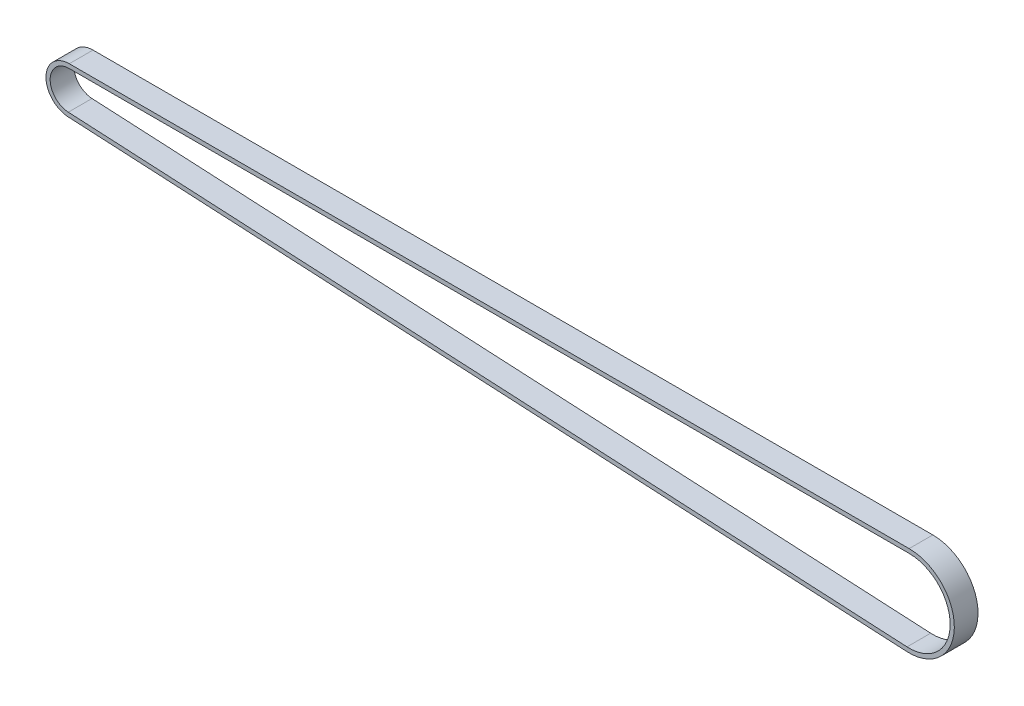
ISO-10303-21;
HEADER;
FILE_DESCRIPTION(('STEP AP214'),'2;1');
FILE_NAME('part.step','',(''),(''),'','','');
FILE_SCHEMA(('AUTOMOTIVE_DESIGN { 1 0 10303 214 1 1 1 1 }'));
ENDSEC;
DATA;
#1=APPLICATION_CONTEXT('core data for automotive mechanical design processes');
#2=APPLICATION_PROTOCOL_DEFINITION('international standard','automotive_design',2000,#1);
#3=PRODUCT_CONTEXT('',#1,'mechanical');
#4=PRODUCT('Part','Part','',(#3));
#5=PRODUCT_RELATED_PRODUCT_CATEGORY('part','',(#4));
#6=PRODUCT_DEFINITION_FORMATION('','',#4);
#7=PRODUCT_DEFINITION_CONTEXT('part definition',#1,'design');
#8=PRODUCT_DEFINITION('design','',#6,#7);
#9=PRODUCT_DEFINITION_SHAPE('','',#8);
#10=(LENGTH_UNIT() NAMED_UNIT(*) SI_UNIT(.MILLI.,.METRE.));
#11=(NAMED_UNIT(*) PLANE_ANGLE_UNIT() SI_UNIT($,.RADIAN.));
#12=(NAMED_UNIT(*) SI_UNIT($,.STERADIAN.) SOLID_ANGLE_UNIT());
#13=UNCERTAINTY_MEASURE_WITH_UNIT(LENGTH_MEASURE(1.E-05),#10,'distance_accuracy_value','');
#14=(GEOMETRIC_REPRESENTATION_CONTEXT(3) GLOBAL_UNCERTAINTY_ASSIGNED_CONTEXT((#13)) GLOBAL_UNIT_ASSIGNED_CONTEXT((#10,
#11,#12)) REPRESENTATION_CONTEXT('',''));
#15=CARTESIAN_POINT('',(0.,0.,0.));
#16=DIRECTION('',(0.,0.,1.));
#17=DIRECTION('',(1.,0.,0.));
#18=AXIS2_PLACEMENT_3D('',#15,#16,#17);
#19=CARTESIAN_POINT('',(0.,0.,6.35));
#20=DIRECTION('',(0.,0.,1.));
#21=DIRECTION('',(1.,0.,0.));
#22=AXIS2_PLACEMENT_3D('',#19,#20,#21);
#23=PLANE('',#22);
#24=CARTESIAN_POINT('',(0.,0.,6.35));
#25=DIRECTION('',(0.,0.,1.));
#26=DIRECTION('',(1.,0.,0.));
#27=AXIS2_PLACEMENT_3D('',#24,#25,#26);
#28=CIRCLE('',#27,6.25305611553386);
#29=CARTESIAN_POINT('',(0.,6.25305611553386,6.35));
#30=VERTEX_POINT('',#29);
#31=CARTESIAN_POINT('',(-0.325435853343736,-6.24458183462863,6.35));
#32=VERTEX_POINT('',#31);
#33=EDGE_CURVE('E134',#30,#32,#28,.T.);
#34=ORIENTED_EDGE('',*,*,#33,.T.);
#35=DIRECTION('',(0.998644777729696,-0.0520442879978777,0.));
#36=VECTOR('',#35,1.);
#37=CARTESIAN_POINT('',(-0.325435853343736,-6.24458183462863,6.35));
#38=LINE('',#37,#36);
#39=CARTESIAN_POINT('',(224.515041815475,-17.9621242824836,6.35));
#40=VERTEX_POINT('',#39);
#41=EDGE_CURVE('E137',#32,#40,#38,.T.);
#42=ORIENTED_EDGE('',*,*,#41,.T.);
#43=CARTESIAN_POINT('',(225.1456,-5.86274388446615,6.35));
#44=DIRECTION('',(0.,0.,1.));
#45=DIRECTION('',(1.,0.,0.));
#46=AXIS2_PLACEMENT_3D('',#43,#44,#45);
#47=CIRCLE('',#46,12.1158);
#48=CARTESIAN_POINT('',(225.1456,6.25305611553385,6.35));
#49=VERTEX_POINT('',#48);
#50=EDGE_CURVE('E140',#40,#49,#47,.T.);
#51=ORIENTED_EDGE('',*,*,#50,.T.);
#52=DIRECTION('',(-1.,0.,0.));
#53=VECTOR('',#52,1.);
#54=CARTESIAN_POINT('',(0.,6.25305611553386,6.35));
#55=LINE('',#54,#53);
#56=EDGE_CURVE('E142',#49,#30,#55,.T.);
#57=ORIENTED_EDGE('',*,*,#56,.T.);
#58=EDGE_LOOP('',(#34,#42,#51,#57));
#59=FACE_BOUND('',#58,.T.);
#60=DIRECTION('',(0.998644777729696,-0.0520442879978777,0.));
#61=VECTOR('',#60,1.);
#62=CARTESIAN_POINT('',(-0.267271157077306,-5.12849643103792,6.35));
#63=LINE('',#62,#61);
#64=CARTESIAN_POINT('',(-0.267271157077306,-5.12849643103792,6.35));
#65=VERTEX_POINT('',#64);
#66=CARTESIAN_POINT('',(224.573206511742,-16.8460388788929,6.35));
#67=VERTEX_POINT('',#66);
#68=EDGE_CURVE('E106',#65,#67,#63,.T.);
#69=ORIENTED_EDGE('',*,*,#68,.F.);
#70=CARTESIAN_POINT('',(0.,0.,6.35));
#71=DIRECTION('',(0.,0.,1.));
#72=DIRECTION('',(1.,0.,0.));
#73=AXIS2_PLACEMENT_3D('',#70,#71,#72);
#74=CIRCLE('',#73,5.13545611553386);
#75=CARTESIAN_POINT('',(0.,5.13545611553385,6.35));
#76=VERTEX_POINT('',#75);
#77=EDGE_CURVE('E98',#76,#65,#74,.T.);
#78=ORIENTED_EDGE('',*,*,#77,.F.);
#79=DIRECTION('',(-1.,0.,0.));
#80=VECTOR('',#79,1.);
#81=CARTESIAN_POINT('',(0.,5.13545611553385,6.35));
#82=LINE('',#81,#80);
#83=CARTESIAN_POINT('',(225.1456,5.13545611553385,6.35));
#84=VERTEX_POINT('',#83);
#85=EDGE_CURVE('E120',#84,#76,#82,.T.);
#86=ORIENTED_EDGE('',*,*,#85,.F.);
#87=CARTESIAN_POINT('',(225.1456,-5.86274388446615,6.35));
#88=DIRECTION('',(0.,0.,1.));
#89=DIRECTION('',(1.,0.,0.));
#90=AXIS2_PLACEMENT_3D('',#87,#88,#89);
#91=CIRCLE('',#90,10.9982);
#92=EDGE_CURVE('E118',#67,#84,#91,.T.);
#93=ORIENTED_EDGE('',*,*,#92,.F.);
#94=EDGE_LOOP('',(#69,#78,#86,#93));
#95=FACE_BOUND('',#94,.T.);
#96=ADVANCED_FACE('F33',(#59,#95),#23,.T.);
#97=CARTESIAN_POINT('',(0.,0.,0.));
#98=DIRECTION('',(0.,0.,1.));
#99=DIRECTION('',(1.,0.,0.));
#100=AXIS2_PLACEMENT_3D('',#97,#98,#99);
#101=PLANE('',#100);
#102=CARTESIAN_POINT('',(0.,0.,0.));
#103=DIRECTION('',(0.,0.,1.));
#104=DIRECTION('',(1.,0.,0.));
#105=AXIS2_PLACEMENT_3D('',#102,#103,#104);
#106=CIRCLE('',#105,6.25305611553386);
#107=CARTESIAN_POINT('',(0.,6.25305611553386,0.));
#108=VERTEX_POINT('',#107);
#109=CARTESIAN_POINT('',(-0.325435853343736,-6.24458183462863,0.));
#110=VERTEX_POINT('',#109);
#111=EDGE_CURVE('E114',#108,#110,#106,.T.);
#112=ORIENTED_EDGE('',*,*,#111,.F.);
#113=DIRECTION('',(-1.,0.,0.));
#114=VECTOR('',#113,1.);
#115=CARTESIAN_POINT('',(0.,6.25305611553386,0.));
#116=LINE('',#115,#114);
#117=CARTESIAN_POINT('',(225.1456,6.25305611553385,0.));
#118=VERTEX_POINT('',#117);
#119=EDGE_CURVE('E138',#118,#108,#116,.T.);
#120=ORIENTED_EDGE('',*,*,#119,.F.);
#121=CARTESIAN_POINT('',(225.1456,-5.86274388446615,0.));
#122=DIRECTION('',(0.,0.,1.));
#123=DIRECTION('',(1.,0.,0.));
#124=AXIS2_PLACEMENT_3D('',#121,#122,#123);
#125=CIRCLE('',#124,12.1158);
#126=CARTESIAN_POINT('',(224.515041815475,-17.9621242824836,0.));
#127=VERTEX_POINT('',#126);
#128=EDGE_CURVE('E149',#127,#118,#125,.T.);
#129=ORIENTED_EDGE('',*,*,#128,.F.);
#130=DIRECTION('',(0.998644777729696,-0.0520442879978777,0.));
#131=VECTOR('',#130,1.);
#132=CARTESIAN_POINT('',(-0.325435853343736,-6.24458183462863,0.));
#133=LINE('',#132,#131);
#134=EDGE_CURVE('E147',#110,#127,#133,.T.);
#135=ORIENTED_EDGE('',*,*,#134,.F.);
#136=EDGE_LOOP('',(#112,#120,#129,#135));
#137=FACE_BOUND('',#136,.T.);
#138=CARTESIAN_POINT('',(0.,0.,0.));
#139=DIRECTION('',(0.,0.,1.));
#140=DIRECTION('',(1.,0.,0.));
#141=AXIS2_PLACEMENT_3D('',#138,#139,#140);
#142=CIRCLE('',#141,5.13545611553386);
#143=CARTESIAN_POINT('',(0.,5.13545611553385,0.));
#144=VERTEX_POINT('',#143);
#145=CARTESIAN_POINT('',(-0.267271157077306,-5.12849643103792,0.));
#146=VERTEX_POINT('',#145);
#147=EDGE_CURVE('E56',#144,#146,#142,.T.);
#148=ORIENTED_EDGE('',*,*,#147,.T.);
#149=DIRECTION('',(0.998644777729696,-0.0520442879978777,0.));
#150=VECTOR('',#149,1.);
#151=CARTESIAN_POINT('',(-0.267271157077306,-5.12849643103792,0.));
#152=LINE('',#151,#150);
#153=CARTESIAN_POINT('',(224.573206511742,-16.8460388788929,0.));
#154=VERTEX_POINT('',#153);
#155=EDGE_CURVE('E113',#146,#154,#152,.T.);
#156=ORIENTED_EDGE('',*,*,#155,.T.);
#157=CARTESIAN_POINT('',(225.1456,-5.86274388446615,0.));
#158=DIRECTION('',(0.,0.,1.));
#159=DIRECTION('',(1.,0.,0.));
#160=AXIS2_PLACEMENT_3D('',#157,#158,#159);
#161=CIRCLE('',#160,10.9982);
#162=CARTESIAN_POINT('',(225.1456,5.13545611553385,0.));
#163=VERTEX_POINT('',#162);
#164=EDGE_CURVE('E126',#154,#163,#161,.T.);
#165=ORIENTED_EDGE('',*,*,#164,.T.);
#166=DIRECTION('',(-1.,0.,0.));
#167=VECTOR('',#166,1.);
#168=CARTESIAN_POINT('',(0.,5.13545611553385,0.));
#169=LINE('',#168,#167);
#170=EDGE_CURVE('E107',#163,#144,#169,.T.);
#171=ORIENTED_EDGE('',*,*,#170,.T.);
#172=EDGE_LOOP('',(#148,#156,#165,#171));
#173=FACE_BOUND('',#172,.T.);
#174=ADVANCED_FACE('F167',(#137,#173),#101,.F.);
#175=CARTESIAN_POINT('',(0.,0.,6.35));
#176=DIRECTION('',(0.,0.,-1.));
#177=DIRECTION('',(-1.,0.,0.));
#178=AXIS2_PLACEMENT_3D('',#175,#176,#177);
#179=CYLINDRICAL_SURFACE('',#178,6.25305611553386);
#180=ORIENTED_EDGE('',*,*,#111,.T.);
#181=DIRECTION('',(0.,0.,-1.));
#182=VECTOR('',#181,1.);
#183=CARTESIAN_POINT('',(-0.325435853343736,-6.24458183462863,6.35));
#184=LINE('',#183,#182);
#185=EDGE_CURVE('E11',#32,#110,#184,.T.);
#186=ORIENTED_EDGE('',*,*,#185,.F.);
#187=ORIENTED_EDGE('',*,*,#33,.F.);
#188=DIRECTION('',(0.,0.,-1.));
#189=VECTOR('',#188,1.);
#190=CARTESIAN_POINT('',(0.,6.25305611553386,6.35));
#191=LINE('',#190,#189);
#192=EDGE_CURVE('E144',#30,#108,#191,.T.);
#193=ORIENTED_EDGE('',*,*,#192,.T.);
#194=EDGE_LOOP('',(#180,#186,#187,#193));
#195=FACE_BOUND('',#194,.T.);
#196=ADVANCED_FACE('F35',(#195),#179,.T.);
#197=CARTESIAN_POINT('',(-0.325435853343736,-6.24458183462863,6.35));
#198=DIRECTION('',(0.0520442879978777,0.998644777729696,0.));
#199=DIRECTION('',(-0.998644777729696,0.0520442879978777,0.));
#200=AXIS2_PLACEMENT_3D('',#197,#198,#199);
#201=PLANE('',#200);
#202=ORIENTED_EDGE('',*,*,#134,.T.);
#203=DIRECTION('',(0.,0.,-1.));
#204=VECTOR('',#203,1.);
#205=CARTESIAN_POINT('',(224.515041815475,-17.9621242824836,6.35));
#206=LINE('',#205,#204);
#207=EDGE_CURVE('E41',#40,#127,#206,.T.);
#208=ORIENTED_EDGE('',*,*,#207,.F.);
#209=ORIENTED_EDGE('',*,*,#41,.F.);
#210=ORIENTED_EDGE('',*,*,#185,.T.);
#211=EDGE_LOOP('',(#202,#208,#209,#210));
#212=FACE_BOUND('',#211,.T.);
#213=ADVANCED_FACE('F177',(#212),#201,.F.);
#214=CARTESIAN_POINT('',(225.1456,-5.86274388446615,6.35));
#215=DIRECTION('',(0.,0.,-1.));
#216=DIRECTION('',(-1.,0.,0.));
#217=AXIS2_PLACEMENT_3D('',#214,#215,#216);
#218=CYLINDRICAL_SURFACE('',#217,12.1158);
#219=ORIENTED_EDGE('',*,*,#128,.T.);
#220=DIRECTION('',(0.,0.,-1.));
#221=VECTOR('',#220,1.);
#222=CARTESIAN_POINT('',(225.1456,6.25305611553385,6.35));
#223=LINE('',#222,#221);
#224=EDGE_CURVE('E154',#49,#118,#223,.T.);
#225=ORIENTED_EDGE('',*,*,#224,.F.);
#226=ORIENTED_EDGE('',*,*,#50,.F.);
#227=ORIENTED_EDGE('',*,*,#207,.T.);
#228=EDGE_LOOP('',(#219,#225,#226,#227));
#229=FACE_BOUND('',#228,.T.);
#230=ADVANCED_FACE('F161',(#229),#218,.T.);
#231=CARTESIAN_POINT('',(0.,6.25305611553386,6.35));
#232=DIRECTION('',(0.,-1.,0.));
#233=DIRECTION('',(1.,0.,0.));
#234=AXIS2_PLACEMENT_3D('',#231,#232,#233);
#235=PLANE('',#234);
#236=ORIENTED_EDGE('',*,*,#119,.T.);
#237=ORIENTED_EDGE('',*,*,#192,.F.);
#238=ORIENTED_EDGE('',*,*,#56,.F.);
#239=ORIENTED_EDGE('',*,*,#224,.T.);
#240=EDGE_LOOP('',(#236,#237,#238,#239));
#241=FACE_BOUND('',#240,.T.);
#242=ADVANCED_FACE('F171',(#241),#235,.F.);
#243=CARTESIAN_POINT('',(0.,0.,6.35));
#244=DIRECTION('',(0.,0.,-1.));
#245=DIRECTION('',(-1.,0.,0.));
#246=AXIS2_PLACEMENT_3D('',#243,#244,#245);
#247=CYLINDRICAL_SURFACE('',#246,5.13545611553386);
#248=ORIENTED_EDGE('',*,*,#147,.F.);
#249=DIRECTION('',(0.,0.,-1.));
#250=VECTOR('',#249,1.);
#251=CARTESIAN_POINT('',(0.,5.13545611553385,6.35));
#252=LINE('',#251,#250);
#253=EDGE_CURVE('E102',#76,#144,#252,.T.);
#254=ORIENTED_EDGE('',*,*,#253,.F.);
#255=ORIENTED_EDGE('',*,*,#77,.T.);
#256=DIRECTION('',(0.,0.,-1.));
#257=VECTOR('',#256,1.);
#258=CARTESIAN_POINT('',(-0.267271157077306,-5.12849643103792,6.35));
#259=LINE('',#258,#257);
#260=EDGE_CURVE('E101',#65,#146,#259,.T.);
#261=ORIENTED_EDGE('',*,*,#260,.T.);
#262=EDGE_LOOP('',(#248,#254,#255,#261));
#263=FACE_BOUND('',#262,.T.);
#264=ADVANCED_FACE('F100',(#263),#247,.F.);
#265=CARTESIAN_POINT('',(-0.267271157077306,-5.12849643103792,6.35));
#266=DIRECTION('',(0.0520442879978777,0.998644777729696,0.));
#267=DIRECTION('',(-0.998644777729696,0.0520442879978777,0.));
#268=AXIS2_PLACEMENT_3D('',#265,#266,#267);
#269=PLANE('',#268);
#270=ORIENTED_EDGE('',*,*,#155,.F.);
#271=ORIENTED_EDGE('',*,*,#260,.F.);
#272=ORIENTED_EDGE('',*,*,#68,.T.);
#273=DIRECTION('',(0.,0.,-1.));
#274=VECTOR('',#273,1.);
#275=CARTESIAN_POINT('',(224.573206511742,-16.8460388788929,6.35));
#276=LINE('',#275,#274);
#277=EDGE_CURVE('E115',#67,#154,#276,.T.);
#278=ORIENTED_EDGE('',*,*,#277,.T.);
#279=EDGE_LOOP('',(#270,#271,#272,#278));
#280=FACE_BOUND('',#279,.T.);
#281=ADVANCED_FACE('F110',(#280),#269,.T.);
#282=CARTESIAN_POINT('',(225.1456,-5.86274388446615,6.35));
#283=DIRECTION('',(0.,0.,-1.));
#284=DIRECTION('',(-1.,0.,0.));
#285=AXIS2_PLACEMENT_3D('',#282,#283,#284);
#286=CYLINDRICAL_SURFACE('',#285,10.9982);
#287=ORIENTED_EDGE('',*,*,#164,.F.);
#288=ORIENTED_EDGE('',*,*,#277,.F.);
#289=ORIENTED_EDGE('',*,*,#92,.T.);
#290=DIRECTION('',(0.,0.,-1.));
#291=VECTOR('',#290,1.);
#292=CARTESIAN_POINT('',(225.1456,5.13545611553385,6.35));
#293=LINE('',#292,#291);
#294=EDGE_CURVE('E48',#84,#163,#293,.T.);
#295=ORIENTED_EDGE('',*,*,#294,.T.);
#296=EDGE_LOOP('',(#287,#288,#289,#295));
#297=FACE_BOUND('',#296,.T.);
#298=ADVANCED_FACE('F200',(#297),#286,.F.);
#299=CARTESIAN_POINT('',(0.,5.13545611553385,6.35));
#300=DIRECTION('',(0.,-1.,0.));
#301=DIRECTION('',(0.,0.,-1.));
#302=AXIS2_PLACEMENT_3D('',#299,#300,#301);
#303=PLANE('',#302);
#304=ORIENTED_EDGE('',*,*,#170,.F.);
#305=ORIENTED_EDGE('',*,*,#294,.F.);
#306=ORIENTED_EDGE('',*,*,#85,.T.);
#307=ORIENTED_EDGE('',*,*,#253,.T.);
#308=EDGE_LOOP('',(#304,#305,#306,#307));
#309=FACE_BOUND('',#308,.T.);
#310=ADVANCED_FACE('F204',(#309),#303,.T.);
#311=CLOSED_SHELL('',(#96,#174,#196,#213,#230,#242,#264,#281,#298,#310));
#312=MANIFOLD_SOLID_BREP('B2',#311);
#313=ADVANCED_BREP_SHAPE_REPRESENTATION('',(#18,#312),#14);
#314=SHAPE_DEFINITION_REPRESENTATION(#9,#313);
ENDSEC;
END-ISO-10303-21;
